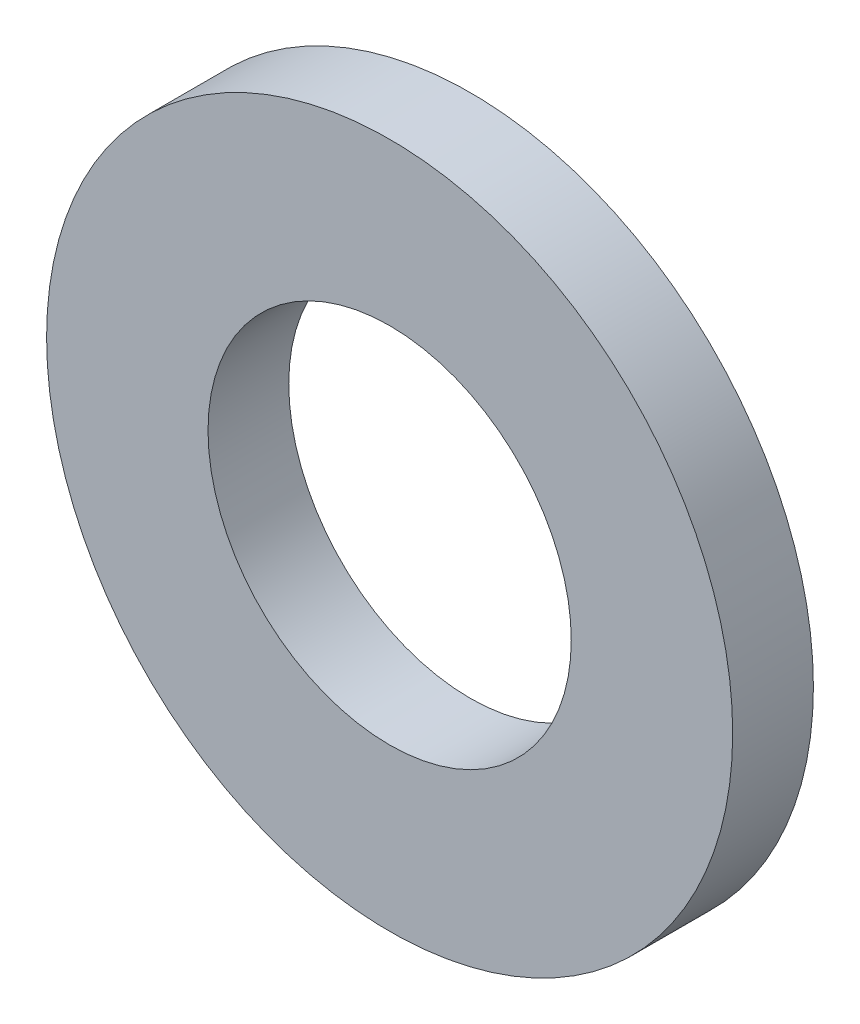
ISO-10303-21;
HEADER;
FILE_DESCRIPTION(('STEP AP214'),'2;1');
FILE_NAME('part.step','',(''),(''),'','','');
FILE_SCHEMA(('AUTOMOTIVE_DESIGN { 1 0 10303 214 1 1 1 1 }'));
ENDSEC;
DATA;
#1=APPLICATION_CONTEXT('core data for automotive mechanical design processes');
#2=APPLICATION_PROTOCOL_DEFINITION('international standard','automotive_design',2000,#1);
#3=PRODUCT_CONTEXT('',#1,'mechanical');
#4=PRODUCT('Part','Part','',(#3));
#5=PRODUCT_RELATED_PRODUCT_CATEGORY('part','',(#4));
#6=PRODUCT_DEFINITION_FORMATION('','',#4);
#7=PRODUCT_DEFINITION_CONTEXT('part definition',#1,'design');
#8=PRODUCT_DEFINITION('design','',#6,#7);
#9=PRODUCT_DEFINITION_SHAPE('','',#8);
#10=(LENGTH_UNIT() NAMED_UNIT(*) SI_UNIT(.MILLI.,.METRE.));
#11=(NAMED_UNIT(*) PLANE_ANGLE_UNIT() SI_UNIT($,.RADIAN.));
#12=(NAMED_UNIT(*) SI_UNIT($,.STERADIAN.) SOLID_ANGLE_UNIT());
#13=UNCERTAINTY_MEASURE_WITH_UNIT(LENGTH_MEASURE(1.E-05),#10,'distance_accuracy_value','');
#14=(GEOMETRIC_REPRESENTATION_CONTEXT(3) GLOBAL_UNCERTAINTY_ASSIGNED_CONTEXT((#13)) GLOBAL_UNIT_ASSIGNED_CONTEXT((#10,
#11,#12)) REPRESENTATION_CONTEXT('',''));
#15=CARTESIAN_POINT('',(0.,0.,0.));
#16=DIRECTION('',(0.,0.,1.));
#17=DIRECTION('',(1.,0.,0.));
#18=AXIS2_PLACEMENT_3D('',#15,#16,#17);
#19=CARTESIAN_POINT('',(0.,0.,1.));
#20=DIRECTION('',(0.,0.,1.));
#21=DIRECTION('',(1.,0.,0.));
#22=AXIS2_PLACEMENT_3D('',#19,#20,#21);
#23=PLANE('',#22);
#24=CARTESIAN_POINT('',(0.,0.,1.));
#25=DIRECTION('',(0.,0.,1.));
#26=DIRECTION('',(1.,0.,0.));
#27=AXIS2_PLACEMENT_3D('',#24,#25,#26);
#28=CIRCLE('',#27,4.25);
#29=CARTESIAN_POINT('',(4.25,0.,1.));
#30=VERTEX_POINT('',#29);
#31=EDGE_CURVE('E10',#30,#30,#28,.T.);
#32=ORIENTED_EDGE('',*,*,#31,.T.);
#33=EDGE_LOOP('',(#32));
#34=FACE_BOUND('',#33,.T.);
#35=CARTESIAN_POINT('',(0.,0.,1.));
#36=DIRECTION('',(0.,0.,1.));
#37=DIRECTION('',(1.,0.,0.));
#38=AXIS2_PLACEMENT_3D('',#35,#36,#37);
#39=CIRCLE('',#38,2.25);
#40=CARTESIAN_POINT('',(2.25,0.,1.));
#41=VERTEX_POINT('',#40);
#42=EDGE_CURVE('E43',#41,#41,#39,.T.);
#43=ORIENTED_EDGE('',*,*,#42,.F.);
#44=EDGE_LOOP('',(#43));
#45=FACE_BOUND('',#44,.T.);
#46=ADVANCED_FACE('F32',(#34,#45),#23,.T.);
#47=CARTESIAN_POINT('',(0.,0.,0.));
#48=DIRECTION('',(0.,0.,1.));
#49=DIRECTION('',(1.,0.,0.));
#50=AXIS2_PLACEMENT_3D('',#47,#48,#49);
#51=PLANE('',#50);
#52=CARTESIAN_POINT('',(0.,0.,0.));
#53=DIRECTION('',(0.,0.,1.));
#54=DIRECTION('',(1.,0.,0.));
#55=AXIS2_PLACEMENT_3D('',#52,#53,#54);
#56=CIRCLE('',#55,4.25);
#57=CARTESIAN_POINT('',(4.25,0.,0.));
#58=VERTEX_POINT('',#57);
#59=EDGE_CURVE('E36',#58,#58,#56,.T.);
#60=ORIENTED_EDGE('',*,*,#59,.F.);
#61=EDGE_LOOP('',(#60));
#62=FACE_BOUND('',#61,.T.);
#63=CARTESIAN_POINT('',(0.,0.,0.));
#64=DIRECTION('',(0.,0.,1.));
#65=DIRECTION('',(1.,0.,0.));
#66=AXIS2_PLACEMENT_3D('',#63,#64,#65);
#67=CIRCLE('',#66,2.25);
#68=CARTESIAN_POINT('',(2.25,0.,0.));
#69=VERTEX_POINT('',#68);
#70=EDGE_CURVE('E45',#69,#69,#67,.T.);
#71=ORIENTED_EDGE('',*,*,#70,.T.);
#72=EDGE_LOOP('',(#71));
#73=FACE_BOUND('',#72,.T.);
#74=ADVANCED_FACE('F55',(#62,#73),#51,.F.);
#75=CARTESIAN_POINT('',(0.,0.,1.));
#76=DIRECTION('',(0.,0.,-1.));
#77=DIRECTION('',(-1.,0.,0.));
#78=AXIS2_PLACEMENT_3D('',#75,#76,#77);
#79=CYLINDRICAL_SURFACE('',#78,4.25);
#80=ORIENTED_EDGE('',*,*,#31,.F.);
#81=EDGE_LOOP('',(#80));
#82=FACE_BOUND('',#81,.T.);
#83=ORIENTED_EDGE('',*,*,#59,.T.);
#84=EDGE_LOOP('',(#83));
#85=FACE_BOUND('',#84,.T.);
#86=ADVANCED_FACE('F34',(#82,#85),#79,.T.);
#87=CARTESIAN_POINT('',(0.,0.,1.));
#88=DIRECTION('',(0.,0.,-1.));
#89=DIRECTION('',(-1.,0.,0.));
#90=AXIS2_PLACEMENT_3D('',#87,#88,#89);
#91=CYLINDRICAL_SURFACE('',#90,2.25);
#92=ORIENTED_EDGE('',*,*,#42,.T.);
#93=EDGE_LOOP('',(#92));
#94=FACE_BOUND('',#93,.T.);
#95=ORIENTED_EDGE('',*,*,#70,.F.);
#96=EDGE_LOOP('',(#95));
#97=FACE_BOUND('',#96,.T.);
#98=ADVANCED_FACE('F51',(#94,#97),#91,.F.);
#99=CLOSED_SHELL('',(#46,#74,#86,#98));
#100=MANIFOLD_SOLID_BREP('B2',#99);
#101=ADVANCED_BREP_SHAPE_REPRESENTATION('',(#18,#100),#14);
#102=SHAPE_DEFINITION_REPRESENTATION(#9,#101);
ENDSEC;
END-ISO-10303-21;
